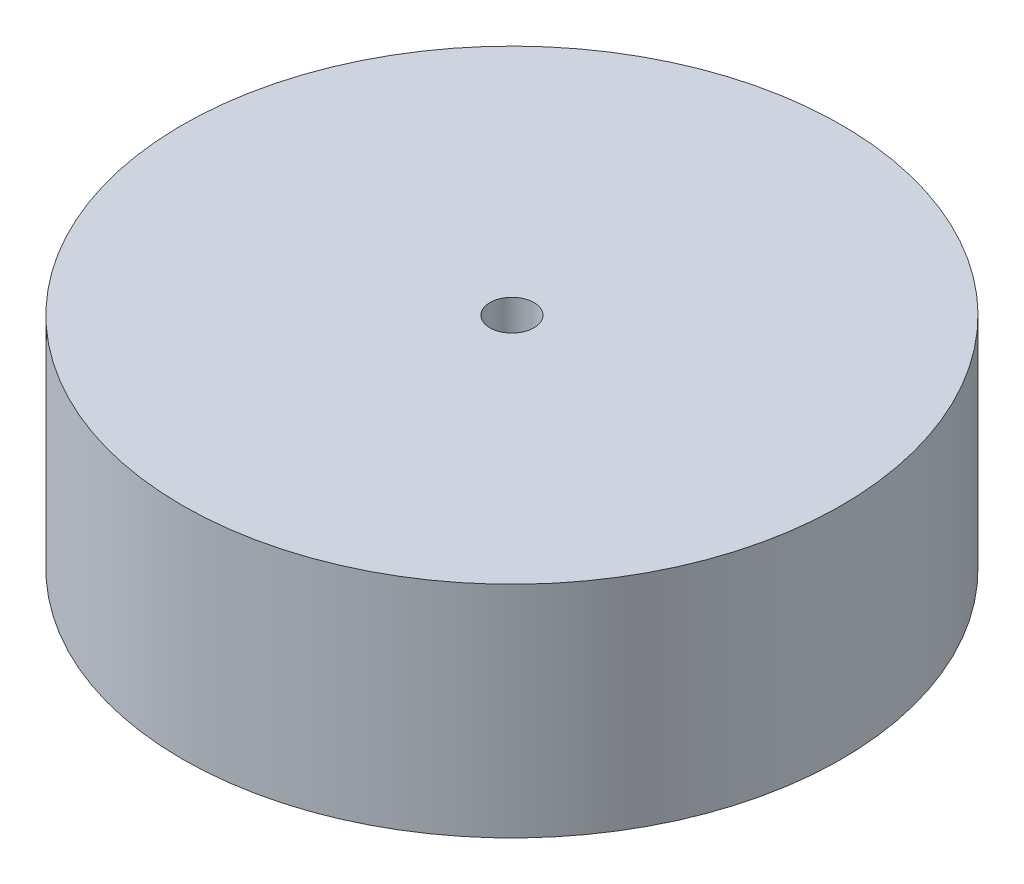
ISO-10303-21;
HEADER;
FILE_DESCRIPTION(('STEP AP214'),'2;1');
FILE_NAME('part.step','',(''),(''),'','','');
FILE_SCHEMA(('AUTOMOTIVE_DESIGN { 1 0 10303 214 1 1 1 1 }'));
ENDSEC;
DATA;
#1=APPLICATION_CONTEXT('core data for automotive mechanical design processes');
#2=APPLICATION_PROTOCOL_DEFINITION('international standard','automotive_design',2000,#1);
#3=PRODUCT_CONTEXT('',#1,'mechanical');
#4=PRODUCT('Part','Part','',(#3));
#5=PRODUCT_RELATED_PRODUCT_CATEGORY('part','',(#4));
#6=PRODUCT_DEFINITION_FORMATION('','',#4);
#7=PRODUCT_DEFINITION_CONTEXT('part definition',#1,'design');
#8=PRODUCT_DEFINITION('design','',#6,#7);
#9=PRODUCT_DEFINITION_SHAPE('','',#8);
#10=(LENGTH_UNIT() NAMED_UNIT(*) SI_UNIT(.MILLI.,.METRE.));
#11=(NAMED_UNIT(*) PLANE_ANGLE_UNIT() SI_UNIT($,.RADIAN.));
#12=(NAMED_UNIT(*) SI_UNIT($,.STERADIAN.) SOLID_ANGLE_UNIT());
#13=UNCERTAINTY_MEASURE_WITH_UNIT(LENGTH_MEASURE(1.E-05),#10,'distance_accuracy_value','');
#14=(GEOMETRIC_REPRESENTATION_CONTEXT(3) GLOBAL_UNCERTAINTY_ASSIGNED_CONTEXT((#13)) GLOBAL_UNIT_ASSIGNED_CONTEXT((#10,
#11,#12)) REPRESENTATION_CONTEXT('',''));
#15=CARTESIAN_POINT('',(0.,0.,0.));
#16=DIRECTION('',(0.,0.,1.));
#17=DIRECTION('',(1.,0.,0.));
#18=AXIS2_PLACEMENT_3D('',#15,#16,#17);
#19=CARTESIAN_POINT('',(0.,10.,0.));
#20=DIRECTION('',(0.,1.,0.));
#21=DIRECTION('',(0.,0.,1.));
#22=AXIS2_PLACEMENT_3D('',#19,#20,#21);
#23=PLANE('',#22);
#24=CARTESIAN_POINT('',(0.,10.,0.));
#25=DIRECTION('',(0.,1.,0.));
#26=DIRECTION('',(0.,0.,1.));
#27=AXIS2_PLACEMENT_3D('',#24,#25,#26);
#28=CIRCLE('',#27,15.);
#29=CARTESIAN_POINT('',(0.,10.,15.));
#30=VERTEX_POINT('',#29);
#31=EDGE_CURVE('E10',#30,#30,#28,.T.);
#32=ORIENTED_EDGE('',*,*,#31,.T.);
#33=EDGE_LOOP('',(#32));
#34=FACE_BOUND('',#33,.T.);
#35=CARTESIAN_POINT('',(0.,10.,0.));
#36=DIRECTION('',(0.,1.,0.));
#37=DIRECTION('',(0.,0.,1.));
#38=AXIS2_PLACEMENT_3D('',#35,#36,#37);
#39=CIRCLE('',#38,1.);
#40=CARTESIAN_POINT('',(0.,10.,1.));
#41=VERTEX_POINT('',#40);
#42=EDGE_CURVE('E42',#41,#41,#39,.T.);
#43=ORIENTED_EDGE('',*,*,#42,.F.);
#44=EDGE_LOOP('',(#43));
#45=FACE_BOUND('',#44,.T.);
#46=ADVANCED_FACE('F31',(#34,#45),#23,.T.);
#47=CARTESIAN_POINT('',(0.,0.,0.));
#48=DIRECTION('',(0.,1.,0.));
#49=DIRECTION('',(0.,0.,1.));
#50=AXIS2_PLACEMENT_3D('',#47,#48,#49);
#51=PLANE('',#50);
#52=CARTESIAN_POINT('',(0.,0.,0.));
#53=DIRECTION('',(0.,1.,0.));
#54=DIRECTION('',(0.,0.,1.));
#55=AXIS2_PLACEMENT_3D('',#52,#53,#54);
#56=CIRCLE('',#55,15.);
#57=CARTESIAN_POINT('',(0.,0.,15.));
#58=VERTEX_POINT('',#57);
#59=EDGE_CURVE('E35',#58,#58,#56,.T.);
#60=ORIENTED_EDGE('',*,*,#59,.F.);
#61=EDGE_LOOP('',(#60));
#62=FACE_BOUND('',#61,.T.);
#63=CARTESIAN_POINT('',(0.,0.,0.));
#64=DIRECTION('',(0.,1.,0.));
#65=DIRECTION('',(0.,0.,1.));
#66=AXIS2_PLACEMENT_3D('',#63,#64,#65);
#67=CIRCLE('',#66,1.);
#68=CARTESIAN_POINT('',(0.,0.,1.));
#69=VERTEX_POINT('',#68);
#70=EDGE_CURVE('E44',#69,#69,#67,.T.);
#71=ORIENTED_EDGE('',*,*,#70,.T.);
#72=EDGE_LOOP('',(#71));
#73=FACE_BOUND('',#72,.T.);
#74=ADVANCED_FACE('F54',(#62,#73),#51,.F.);
#75=CARTESIAN_POINT('',(0.,10.,0.));
#76=DIRECTION('',(0.,-1.,0.));
#77=DIRECTION('',(0.,0.,-1.));
#78=AXIS2_PLACEMENT_3D('',#75,#76,#77);
#79=CYLINDRICAL_SURFACE('',#78,15.);
#80=ORIENTED_EDGE('',*,*,#31,.F.);
#81=EDGE_LOOP('',(#80));
#82=FACE_BOUND('',#81,.T.);
#83=ORIENTED_EDGE('',*,*,#59,.T.);
#84=EDGE_LOOP('',(#83));
#85=FACE_BOUND('',#84,.T.);
#86=ADVANCED_FACE('F33',(#82,#85),#79,.T.);
#87=CARTESIAN_POINT('',(0.,10.,0.));
#88=DIRECTION('',(0.,-1.,0.));
#89=DIRECTION('',(0.,0.,-1.));
#90=AXIS2_PLACEMENT_3D('',#87,#88,#89);
#91=CYLINDRICAL_SURFACE('',#90,1.);
#92=ORIENTED_EDGE('',*,*,#42,.T.);
#93=EDGE_LOOP('',(#92));
#94=FACE_BOUND('',#93,.T.);
#95=ORIENTED_EDGE('',*,*,#70,.F.);
#96=EDGE_LOOP('',(#95));
#97=FACE_BOUND('',#96,.T.);
#98=ADVANCED_FACE('F50',(#94,#97),#91,.F.);
#99=CLOSED_SHELL('',(#46,#74,#86,#98));
#100=MANIFOLD_SOLID_BREP('B2',#99);
#101=ADVANCED_BREP_SHAPE_REPRESENTATION('',(#18,#100),#14);
#102=SHAPE_DEFINITION_REPRESENTATION(#9,#101);
ENDSEC;
END-ISO-10303-21;
